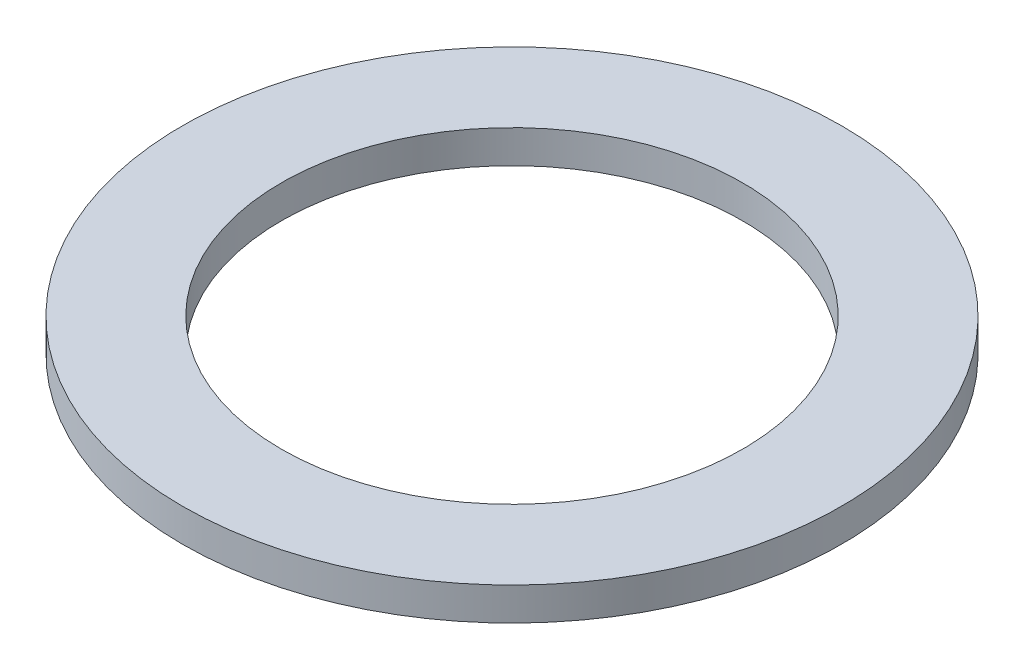
ISO-10303-21;
HEADER;
FILE_DESCRIPTION(('STEP AP214'),'2;1');
FILE_NAME('part.step','',(''),(''),'','','');
FILE_SCHEMA(('AUTOMOTIVE_DESIGN { 1 0 10303 214 1 1 1 1 }'));
ENDSEC;
DATA;
#1=APPLICATION_CONTEXT('core data for automotive mechanical design processes');
#2=APPLICATION_PROTOCOL_DEFINITION('international standard','automotive_design',2000,#1);
#3=PRODUCT_CONTEXT('',#1,'mechanical');
#4=PRODUCT('Part','Part','',(#3));
#5=PRODUCT_RELATED_PRODUCT_CATEGORY('part','',(#4));
#6=PRODUCT_DEFINITION_FORMATION('','',#4);
#7=PRODUCT_DEFINITION_CONTEXT('part definition',#1,'design');
#8=PRODUCT_DEFINITION('design','',#6,#7);
#9=PRODUCT_DEFINITION_SHAPE('','',#8);
#10=(LENGTH_UNIT() NAMED_UNIT(*) SI_UNIT(.MILLI.,.METRE.));
#11=(NAMED_UNIT(*) PLANE_ANGLE_UNIT() SI_UNIT($,.RADIAN.));
#12=(NAMED_UNIT(*) SI_UNIT($,.STERADIAN.) SOLID_ANGLE_UNIT());
#13=UNCERTAINTY_MEASURE_WITH_UNIT(LENGTH_MEASURE(1.E-05),#10,'distance_accuracy_value','');
#14=(GEOMETRIC_REPRESENTATION_CONTEXT(3) GLOBAL_UNCERTAINTY_ASSIGNED_CONTEXT((#13)) GLOBAL_UNIT_ASSIGNED_CONTEXT((#10,
#11,#12)) REPRESENTATION_CONTEXT('',''));
#15=CARTESIAN_POINT('',(0.,0.,0.));
#16=DIRECTION('',(0.,0.,1.));
#17=DIRECTION('',(1.,0.,0.));
#18=AXIS2_PLACEMENT_3D('',#15,#16,#17);
#19=CARTESIAN_POINT('',(0.,0.6,0.));
#20=DIRECTION('',(0.,1.,0.));
#21=DIRECTION('',(0.,0.,1.));
#22=AXIS2_PLACEMENT_3D('',#19,#20,#21);
#23=PLANE('',#22);
#24=CARTESIAN_POINT('',(0.,0.6,0.));
#25=DIRECTION('',(0.,1.,0.));
#26=DIRECTION('',(0.,0.,1.));
#27=AXIS2_PLACEMENT_3D('',#24,#25,#26);
#28=CIRCLE('',#27,6.);
#29=CARTESIAN_POINT('',(0.,0.6,6.));
#30=VERTEX_POINT('',#29);
#31=EDGE_CURVE('E10',#30,#30,#28,.T.);
#32=ORIENTED_EDGE('',*,*,#31,.T.);
#33=EDGE_LOOP('',(#32));
#34=FACE_BOUND('',#33,.T.);
#35=CARTESIAN_POINT('',(0.,0.6,0.));
#36=DIRECTION('',(0.,1.,0.));
#37=DIRECTION('',(0.,0.,1.));
#38=AXIS2_PLACEMENT_3D('',#35,#36,#37);
#39=CIRCLE('',#38,4.2);
#40=CARTESIAN_POINT('',(0.,0.6,4.2));
#41=VERTEX_POINT('',#40);
#42=EDGE_CURVE('E43',#41,#41,#39,.T.);
#43=ORIENTED_EDGE('',*,*,#42,.F.);
#44=EDGE_LOOP('',(#43));
#45=FACE_BOUND('',#44,.T.);
#46=ADVANCED_FACE('F32',(#34,#45),#23,.T.);
#47=CARTESIAN_POINT('',(0.,0.,0.));
#48=DIRECTION('',(0.,1.,0.));
#49=DIRECTION('',(0.,0.,1.));
#50=AXIS2_PLACEMENT_3D('',#47,#48,#49);
#51=PLANE('',#50);
#52=CARTESIAN_POINT('',(0.,0.,0.));
#53=DIRECTION('',(0.,1.,0.));
#54=DIRECTION('',(0.,0.,1.));
#55=AXIS2_PLACEMENT_3D('',#52,#53,#54);
#56=CIRCLE('',#55,6.);
#57=CARTESIAN_POINT('',(0.,0.,6.));
#58=VERTEX_POINT('',#57);
#59=EDGE_CURVE('E36',#58,#58,#56,.T.);
#60=ORIENTED_EDGE('',*,*,#59,.F.);
#61=EDGE_LOOP('',(#60));
#62=FACE_BOUND('',#61,.T.);
#63=CARTESIAN_POINT('',(0.,0.,0.));
#64=DIRECTION('',(0.,1.,0.));
#65=DIRECTION('',(0.,0.,1.));
#66=AXIS2_PLACEMENT_3D('',#63,#64,#65);
#67=CIRCLE('',#66,4.2);
#68=CARTESIAN_POINT('',(0.,0.,4.2));
#69=VERTEX_POINT('',#68);
#70=EDGE_CURVE('E45',#69,#69,#67,.T.);
#71=ORIENTED_EDGE('',*,*,#70,.T.);
#72=EDGE_LOOP('',(#71));
#73=FACE_BOUND('',#72,.T.);
#74=ADVANCED_FACE('F55',(#62,#73),#51,.F.);
#75=CARTESIAN_POINT('',(0.,0.6,0.));
#76=DIRECTION('',(0.,-1.,0.));
#77=DIRECTION('',(0.,0.,-1.));
#78=AXIS2_PLACEMENT_3D('',#75,#76,#77);
#79=CYLINDRICAL_SURFACE('',#78,6.);
#80=ORIENTED_EDGE('',*,*,#31,.F.);
#81=EDGE_LOOP('',(#80));
#82=FACE_BOUND('',#81,.T.);
#83=ORIENTED_EDGE('',*,*,#59,.T.);
#84=EDGE_LOOP('',(#83));
#85=FACE_BOUND('',#84,.T.);
#86=ADVANCED_FACE('F34',(#82,#85),#79,.T.);
#87=CARTESIAN_POINT('',(0.,0.6,0.));
#88=DIRECTION('',(0.,-1.,0.));
#89=DIRECTION('',(0.,0.,-1.));
#90=AXIS2_PLACEMENT_3D('',#87,#88,#89);
#91=CYLINDRICAL_SURFACE('',#90,4.2);
#92=ORIENTED_EDGE('',*,*,#42,.T.);
#93=EDGE_LOOP('',(#92));
#94=FACE_BOUND('',#93,.T.);
#95=ORIENTED_EDGE('',*,*,#70,.F.);
#96=EDGE_LOOP('',(#95));
#97=FACE_BOUND('',#96,.T.);
#98=ADVANCED_FACE('F51',(#94,#97),#91,.F.);
#99=CLOSED_SHELL('',(#46,#74,#86,#98));
#100=MANIFOLD_SOLID_BREP('B2',#99);
#101=ADVANCED_BREP_SHAPE_REPRESENTATION('',(#18,#100),#14);
#102=SHAPE_DEFINITION_REPRESENTATION(#9,#101);
ENDSEC;
END-ISO-10303-21;
